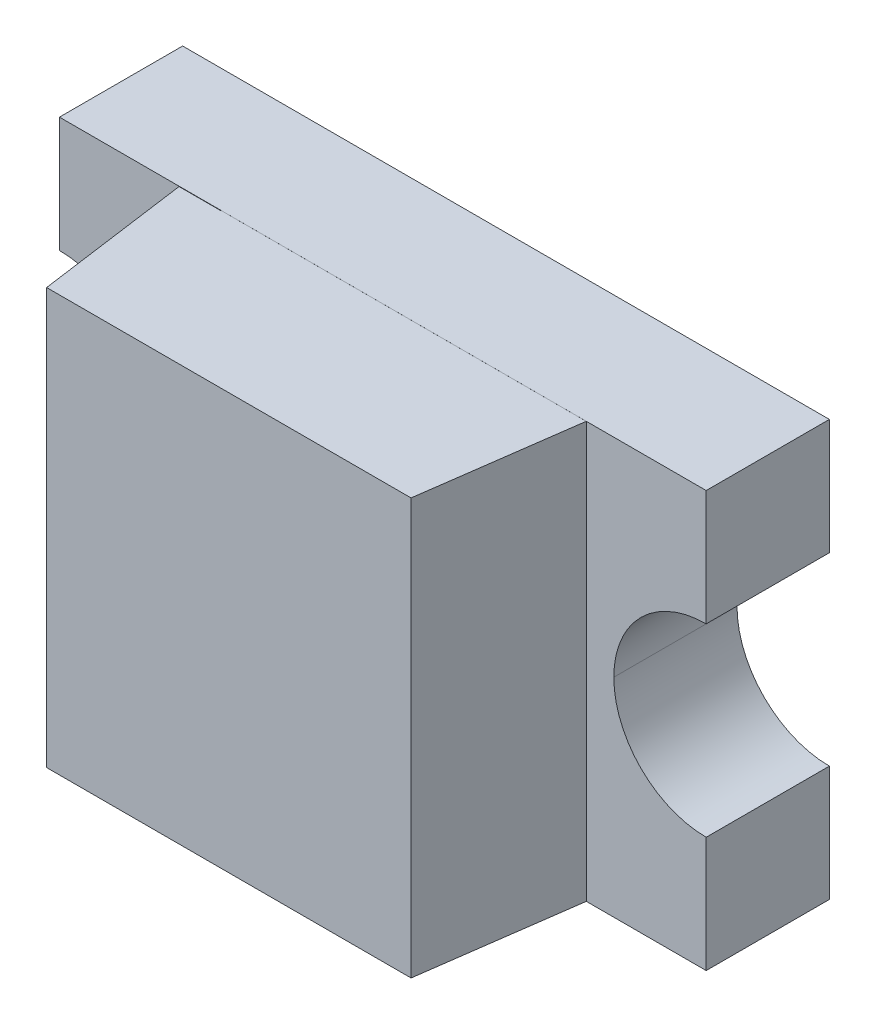
ISO-10303-21;
HEADER;
FILE_DESCRIPTION(('STEP AP214'),'2;1');
FILE_NAME('part.step','',(''),(''),'','','');
FILE_SCHEMA(('AUTOMOTIVE_DESIGN { 1 0 10303 214 1 1 1 1 }'));
ENDSEC;
DATA;
#1=APPLICATION_CONTEXT('core data for automotive mechanical design processes');
#2=APPLICATION_PROTOCOL_DEFINITION('international standard','automotive_design',2000,#1);
#3=PRODUCT_CONTEXT('',#1,'mechanical');
#4=PRODUCT('Part','Part','',(#3));
#5=PRODUCT_RELATED_PRODUCT_CATEGORY('part','',(#4));
#6=PRODUCT_DEFINITION_FORMATION('','',#4);
#7=PRODUCT_DEFINITION_CONTEXT('part definition',#1,'design');
#8=PRODUCT_DEFINITION('design','',#6,#7);
#9=PRODUCT_DEFINITION_SHAPE('','',#8);
#10=(LENGTH_UNIT() NAMED_UNIT(*) SI_UNIT(.MILLI.,.METRE.));
#11=(NAMED_UNIT(*) PLANE_ANGLE_UNIT() SI_UNIT($,.RADIAN.));
#12=(NAMED_UNIT(*) SI_UNIT($,.STERADIAN.) SOLID_ANGLE_UNIT());
#13=UNCERTAINTY_MEASURE_WITH_UNIT(LENGTH_MEASURE(1.E-05),#10,'distance_accuracy_value','');
#14=(GEOMETRIC_REPRESENTATION_CONTEXT(3) GLOBAL_UNCERTAINTY_ASSIGNED_CONTEXT((#13)) GLOBAL_UNIT_ASSIGNED_CONTEXT((#10,
#11,#12)) REPRESENTATION_CONTEXT('',''));
#15=CARTESIAN_POINT('',(0.,0.,0.));
#16=DIRECTION('',(0.,0.,1.));
#17=DIRECTION('',(1.,0.,0.));
#18=AXIS2_PLACEMENT_3D('',#15,#16,#17);
#19=CARTESIAN_POINT('',(0.,-0.675,0.));
#20=DIRECTION('',(0.,-1.,0.));
#21=DIRECTION('',(-1.,0.,0.));
#22=AXIS2_PLACEMENT_3D('',#19,#20,#21);
#23=PLANE('',#22);
#24=DIRECTION('',(-0.136719942335739,0.,-0.990609740194246));
#25=VECTOR('',#24,1.);
#26=CARTESIAN_POINT('',(-0.59167338261961,-0.675,0.9));
#27=LINE('',#26,#25);
#28=CARTESIAN_POINT('',(-0.59167338261961,-0.675,0.9));
#29=VERTEX_POINT('',#28);
#30=CARTESIAN_POINT('',(-0.660529539049008,-0.675,0.4011));
#31=VERTEX_POINT('',#30);
#32=EDGE_CURVE('P0_E11',#29,#31,#27,.T.);
#33=ORIENTED_EDGE('',*,*,#32,.T.);
#34=DIRECTION('',(-1.,0.,0.));
#35=VECTOR('',#34,1.);
#36=CARTESIAN_POINT('',(-0.524639744919153,-0.675,0.4011));
#37=LINE('',#36,#35);
#38=CARTESIAN_POINT('',(-0.524639744919153,-0.675,0.4011));
#39=VERTEX_POINT('',#38);
#40=EDGE_CURVE('P0_E134',#39,#31,#37,.T.);
#41=ORIENTED_EDGE('',*,*,#40,.F.);
#42=DIRECTION('',(0.,0.,1.));
#43=VECTOR('',#42,1.);
#44=CARTESIAN_POINT('',(-0.524639744919153,-0.675,0.4001));
#45=LINE('',#44,#43);
#46=CARTESIAN_POINT('',(-0.524639744919153,-0.675,0.4001));
#47=VERTEX_POINT('',#46);
#48=EDGE_CURVE('P0_E63',#47,#39,#45,.T.);
#49=ORIENTED_EDGE('',*,*,#48,.F.);
#50=DIRECTION('',(-1.,0.,0.));
#51=VECTOR('',#50,1.);
#52=CARTESIAN_POINT('',(0.660681356591747,-0.675,0.4001));
#53=LINE('',#52,#51);
#54=CARTESIAN_POINT('',(0.660681356591747,-0.675,0.4001));
#55=VERTEX_POINT('',#54);
#56=EDGE_CURVE('P0_E101',#55,#47,#53,.T.);
#57=ORIENTED_EDGE('',*,*,#56,.F.);
#58=DIRECTION('',(-0.136746780418113,0.,0.990606035740385));
#59=VECTOR('',#58,1.);
#60=CARTESIAN_POINT('',(0.660681356591747,-0.675,0.4001));
#61=LINE('',#60,#59);
#62=CARTESIAN_POINT('',(0.591673382619609,-0.675,0.9));
#63=VERTEX_POINT('',#62);
#64=EDGE_CURVE('P0_E107',#55,#63,#61,.T.);
#65=ORIENTED_EDGE('',*,*,#64,.T.);
#66=DIRECTION('',(1.,0.,0.));
#67=VECTOR('',#66,1.);
#68=CARTESIAN_POINT('',(-0.59167338261961,-0.675,0.9));
#69=LINE('',#68,#67);
#70=EDGE_CURVE('P0_E124',#29,#63,#69,.T.);
#71=ORIENTED_EDGE('',*,*,#70,.F.);
#72=EDGE_LOOP('',(#33,#41,#49,#57,#65,#71));
#73=FACE_BOUND('',#72,.T.);
#74=ADVANCED_FACE('P0_F16',(#73),#23,.T.);
#75=CARTESIAN_POINT('',(0.,0.675,0.));
#76=DIRECTION('',(0.,-1.,0.));
#77=DIRECTION('',(-1.,0.,0.));
#78=AXIS2_PLACEMENT_3D('',#75,#76,#77);
#79=PLANE('',#78);
#80=DIRECTION('',(1.,0.,0.));
#81=VECTOR('',#80,1.);
#82=CARTESIAN_POINT('',(-0.52463974491915,0.675,0.4011));
#83=LINE('',#82,#81);
#84=CARTESIAN_POINT('',(-0.660529539049006,0.675,0.4011));
#85=VERTEX_POINT('',#84);
#86=CARTESIAN_POINT('',(-0.52463974491915,0.675,0.4011));
#87=VERTEX_POINT('',#86);
#88=EDGE_CURVE('P0_E141',#85,#87,#83,.T.);
#89=ORIENTED_EDGE('',*,*,#88,.F.);
#90=DIRECTION('',(-0.136719942335739,0.,-0.990609740194246));
#91=VECTOR('',#90,1.);
#92=CARTESIAN_POINT('',(-0.591673382619608,0.675,0.9));
#93=LINE('',#92,#91);
#94=CARTESIAN_POINT('',(-0.591673382619608,0.675,0.9));
#95=VERTEX_POINT('',#94);
#96=EDGE_CURVE('P0_E25',#95,#85,#93,.T.);
#97=ORIENTED_EDGE('',*,*,#96,.F.);
#98=DIRECTION('',(-1.,0.,0.));
#99=VECTOR('',#98,1.);
#100=CARTESIAN_POINT('',(-0.591673382619608,0.675,0.9));
#101=LINE('',#100,#99);
#102=CARTESIAN_POINT('',(0.591673382619611,0.675,0.9));
#103=VERTEX_POINT('',#102);
#104=EDGE_CURVE('P0_E95',#103,#95,#101,.T.);
#105=ORIENTED_EDGE('',*,*,#104,.F.);
#106=DIRECTION('',(-0.136746780418113,0.,0.990606035740385));
#107=VECTOR('',#106,1.);
#108=CARTESIAN_POINT('',(0.660681356591749,0.675,0.4001));
#109=LINE('',#108,#107);
#110=CARTESIAN_POINT('',(0.660681356591749,0.675,0.4001));
#111=VERTEX_POINT('',#110);
#112=EDGE_CURVE('P0_E88',#111,#103,#109,.T.);
#113=ORIENTED_EDGE('',*,*,#112,.F.);
#114=DIRECTION('',(1.,0.,0.));
#115=VECTOR('',#114,1.);
#116=CARTESIAN_POINT('',(0.660681356591749,0.675,0.4001));
#117=LINE('',#116,#115);
#118=CARTESIAN_POINT('',(-0.52463974491915,0.675,0.4001));
#119=VERTEX_POINT('',#118);
#120=EDGE_CURVE('P0_E92',#119,#111,#117,.T.);
#121=ORIENTED_EDGE('',*,*,#120,.F.);
#122=DIRECTION('',(0.,0.,-1.));
#123=VECTOR('',#122,1.);
#124=CARTESIAN_POINT('',(-0.52463974491915,0.675,0.4001));
#125=LINE('',#124,#123);
#126=EDGE_CURVE('P0_E78',#87,#119,#125,.T.);
#127=ORIENTED_EDGE('',*,*,#126,.F.);
#128=EDGE_LOOP('',(#89,#97,#105,#113,#121,#127));
#129=FACE_BOUND('',#128,.T.);
#130=ADVANCED_FACE('P0_F90',(#129),#79,.F.);
#131=CARTESIAN_POINT('',(-0.626101460834309,-0.675,0.65055));
#132=DIRECTION('',(-0.990609740194246,0.,0.136719942335739));
#133=DIRECTION('',(0.,1.,0.));
#134=AXIS2_PLACEMENT_3D('',#131,#132,#133);
#135=PLANE('',#134);
#136=ORIENTED_EDGE('',*,*,#96,.T.);
#137=DIRECTION('',(0.,1.,0.));
#138=VECTOR('',#137,1.);
#139=CARTESIAN_POINT('',(-0.660529539049008,-0.675,0.4011));
#140=LINE('',#139,#138);
#141=EDGE_CURVE('P0_E130',#31,#85,#140,.T.);
#142=ORIENTED_EDGE('',*,*,#141,.F.);
#143=ORIENTED_EDGE('',*,*,#32,.F.);
#144=DIRECTION('',(0.,1.,0.));
#145=VECTOR('',#144,1.);
#146=CARTESIAN_POINT('',(-0.59167338261961,-0.675,0.9));
#147=LINE('',#146,#145);
#148=EDGE_CURVE('P0_E125',#29,#95,#147,.T.);
#149=ORIENTED_EDGE('',*,*,#148,.T.);
#150=EDGE_LOOP('',(#136,#142,#143,#149));
#151=FACE_BOUND('',#150,.T.);
#152=ADVANCED_FACE('P0_F170',(#151),#135,.T.);
#153=CARTESIAN_POINT('',(0.,-0.675,0.9));
#154=DIRECTION('',(0.,0.,1.));
#155=DIRECTION('',(0.,-1.,0.));
#156=AXIS2_PLACEMENT_3D('',#153,#154,#155);
#157=PLANE('',#156);
#158=ORIENTED_EDGE('',*,*,#104,.T.);
#159=ORIENTED_EDGE('',*,*,#148,.F.);
#160=ORIENTED_EDGE('',*,*,#70,.T.);
#161=DIRECTION('',(0.,1.,0.));
#162=VECTOR('',#161,1.);
#163=CARTESIAN_POINT('',(0.591673382619609,-0.675,0.9));
#164=LINE('',#163,#162);
#165=EDGE_CURVE('P0_E100',#63,#103,#164,.T.);
#166=ORIENTED_EDGE('',*,*,#165,.T.);
#167=EDGE_LOOP('',(#158,#159,#160,#166));
#168=FACE_BOUND('',#167,.T.);
#169=ADVANCED_FACE('P0_F151',(#168),#157,.T.);
#170=CARTESIAN_POINT('',(0.626177369605678,-0.675,0.65005));
#171=DIRECTION('',(0.990606035740385,0.,0.136746780418113));
#172=DIRECTION('',(0.,-1.,0.));
#173=AXIS2_PLACEMENT_3D('',#170,#171,#172);
#174=PLANE('',#173);
#175=ORIENTED_EDGE('',*,*,#112,.T.);
#176=ORIENTED_EDGE('',*,*,#165,.F.);
#177=ORIENTED_EDGE('',*,*,#64,.F.);
#178=DIRECTION('',(0.,1.,0.));
#179=VECTOR('',#178,1.);
#180=CARTESIAN_POINT('',(0.660681356591747,-0.675,0.4001));
#181=LINE('',#180,#179);
#182=EDGE_CURVE('P0_E104',#55,#111,#181,.T.);
#183=ORIENTED_EDGE('',*,*,#182,.T.);
#184=EDGE_LOOP('',(#175,#176,#177,#183));
#185=FACE_BOUND('',#184,.T.);
#186=ADVANCED_FACE('P0_F105',(#185),#174,.T.);
#187=CARTESIAN_POINT('',(0.0680208058362969,-0.675,0.4001));
#188=DIRECTION('',(0.,0.,-1.));
#189=DIRECTION('',(-1.,0.,0.));
#190=AXIS2_PLACEMENT_3D('',#187,#188,#189);
#191=PLANE('',#190);
#192=ORIENTED_EDGE('',*,*,#120,.T.);
#193=ORIENTED_EDGE('',*,*,#182,.F.);
#194=ORIENTED_EDGE('',*,*,#56,.T.);
#195=DIRECTION('',(0.,1.,0.));
#196=VECTOR('',#195,1.);
#197=CARTESIAN_POINT('',(-0.524639744919153,-0.675,0.4001));
#198=LINE('',#197,#196);
#199=EDGE_CURVE('P0_E113',#47,#119,#198,.T.);
#200=ORIENTED_EDGE('',*,*,#199,.T.);
#201=EDGE_LOOP('',(#192,#193,#194,#200));
#202=FACE_BOUND('',#201,.T.);
#203=ADVANCED_FACE('P0_F112',(#202),#191,.T.);
#204=CARTESIAN_POINT('',(-0.524639744919153,-0.675,0.4006));
#205=DIRECTION('',(-1.,0.,0.));
#206=DIRECTION('',(0.,0.,1.));
#207=AXIS2_PLACEMENT_3D('',#204,#205,#206);
#208=PLANE('',#207);
#209=ORIENTED_EDGE('',*,*,#126,.T.);
#210=ORIENTED_EDGE('',*,*,#199,.F.);
#211=ORIENTED_EDGE('',*,*,#48,.T.);
#212=DIRECTION('',(0.,1.,0.));
#213=VECTOR('',#212,1.);
#214=CARTESIAN_POINT('',(-0.524639744919153,-0.675,0.4011));
#215=LINE('',#214,#213);
#216=EDGE_CURVE('P0_E144',#39,#87,#215,.T.);
#217=ORIENTED_EDGE('',*,*,#216,.T.);
#218=EDGE_LOOP('',(#209,#210,#211,#217));
#219=FACE_BOUND('',#218,.T.);
#220=ADVANCED_FACE('P0_F223',(#219),#208,.T.);
#221=CARTESIAN_POINT('',(-0.59258464198408,-0.675,0.4011));
#222=DIRECTION('',(0.,0.,-1.));
#223=DIRECTION('',(0.,-1.,0.));
#224=AXIS2_PLACEMENT_3D('',#221,#222,#223);
#225=PLANE('',#224);
#226=ORIENTED_EDGE('',*,*,#88,.T.);
#227=ORIENTED_EDGE('',*,*,#216,.F.);
#228=ORIENTED_EDGE('',*,*,#40,.T.);
#229=ORIENTED_EDGE('',*,*,#141,.T.);
#230=EDGE_LOOP('',(#226,#227,#228,#229));
#231=FACE_BOUND('',#230,.T.);
#232=ADVANCED_FACE('P0_F169',(#231),#225,.T.);
#233=CLOSED_SHELL('',(#74,#130,#152,#169,#186,#203,#220,#232));
#234=MANIFOLD_SOLID_BREP('P0_B1',#233);
#235=CARTESIAN_POINT('',(0.,0.675,0.));
#236=DIRECTION('',(0.,1.,0.));
#237=DIRECTION('',(1.,0.,0.));
#238=AXIS2_PLACEMENT_3D('',#235,#236,#237);
#239=PLANE('',#238);
#240=DIRECTION('',(1.,0.,0.));
#241=VECTOR('',#240,1.);
#242=CARTESIAN_POINT('',(1.05,0.675,0.4));
#243=LINE('',#242,#241);
#244=CARTESIAN_POINT('',(-1.05,0.675,0.4));
#245=VERTEX_POINT('',#244);
#246=CARTESIAN_POINT('',(1.05,0.675,0.4));
#247=VERTEX_POINT('',#246);
#248=EDGE_CURVE('P1_E176',#245,#247,#243,.T.);
#249=ORIENTED_EDGE('',*,*,#248,.T.);
#250=DIRECTION('',(0.,0.,1.));
#251=VECTOR('',#250,1.);
#252=CARTESIAN_POINT('',(1.05,0.675,0.));
#253=LINE('',#252,#251);
#254=CARTESIAN_POINT('',(1.05,0.675,0.));
#255=VERTEX_POINT('',#254);
#256=EDGE_CURVE('P1_E162',#255,#247,#253,.T.);
#257=ORIENTED_EDGE('',*,*,#256,.F.);
#258=DIRECTION('',(-1.,0.,0.));
#259=VECTOR('',#258,1.);
#260=CARTESIAN_POINT('',(1.05,0.675,0.));
#261=LINE('',#260,#259);
#262=CARTESIAN_POINT('',(-1.05,0.675,0.));
#263=VERTEX_POINT('',#262);
#264=EDGE_CURVE('P1_E20',#255,#263,#261,.T.);
#265=ORIENTED_EDGE('',*,*,#264,.T.);
#266=DIRECTION('',(0.,0.,1.));
#267=VECTOR('',#266,1.);
#268=CARTESIAN_POINT('',(-1.05,0.675,0.));
#269=LINE('',#268,#267);
#270=EDGE_CURVE('P1_E27',#263,#245,#269,.T.);
#271=ORIENTED_EDGE('',*,*,#270,.T.);
#272=EDGE_LOOP('',(#249,#257,#265,#271));
#273=FACE_BOUND('',#272,.T.);
#274=ADVANCED_FACE('P1_F16',(#273),#239,.T.);
#275=CARTESIAN_POINT('',(0.,-0.675,0.));
#276=DIRECTION('',(0.,-1.,0.));
#277=DIRECTION('',(-1.,0.,0.));
#278=AXIS2_PLACEMENT_3D('',#275,#276,#277);
#279=PLANE('',#278);
#280=DIRECTION('',(-1.,0.,0.));
#281=VECTOR('',#280,1.);
#282=CARTESIAN_POINT('',(-1.05,-0.675,0.4));
#283=LINE('',#282,#281);
#284=CARTESIAN_POINT('',(1.05,-0.675,0.4));
#285=VERTEX_POINT('',#284);
#286=CARTESIAN_POINT('',(-1.05,-0.675,0.4));
#287=VERTEX_POINT('',#286);
#288=EDGE_CURVE('P1_E182',#285,#287,#283,.T.);
#289=ORIENTED_EDGE('',*,*,#288,.T.);
#290=DIRECTION('',(0.,0.,1.));
#291=VECTOR('',#290,1.);
#292=CARTESIAN_POINT('',(-1.05,-0.675,0.));
#293=LINE('',#292,#291);
#294=CARTESIAN_POINT('',(-1.05,-0.675,0.));
#295=VERTEX_POINT('',#294);
#296=EDGE_CURVE('P1_E11',#295,#287,#293,.T.);
#297=ORIENTED_EDGE('',*,*,#296,.F.);
#298=DIRECTION('',(1.,0.,0.));
#299=VECTOR('',#298,1.);
#300=CARTESIAN_POINT('',(-1.05,-0.675,0.));
#301=LINE('',#300,#299);
#302=CARTESIAN_POINT('',(1.05,-0.675,0.));
#303=VERTEX_POINT('',#302);
#304=EDGE_CURVE('P1_E186',#295,#303,#301,.T.);
#305=ORIENTED_EDGE('',*,*,#304,.T.);
#306=DIRECTION('',(0.,0.,1.));
#307=VECTOR('',#306,1.);
#308=CARTESIAN_POINT('',(1.05,-0.675,0.));
#309=LINE('',#308,#307);
#310=EDGE_CURVE('P1_E181',#303,#285,#309,.T.);
#311=ORIENTED_EDGE('',*,*,#310,.T.);
#312=EDGE_LOOP('',(#289,#297,#305,#311));
#313=FACE_BOUND('',#312,.T.);
#314=ADVANCED_FACE('P1_F255',(#313),#279,.T.);
#315=CARTESIAN_POINT('',(-1.05,-0.4875,0.));
#316=DIRECTION('',(-1.,0.,0.));
#317=DIRECTION('',(0.,1.,0.));
#318=AXIS2_PLACEMENT_3D('',#315,#316,#317);
#319=PLANE('',#318);
#320=DIRECTION('',(0.,0.,1.));
#321=VECTOR('',#320,1.);
#322=CARTESIAN_POINT('',(-1.05,-0.3,0.4));
#323=LINE('',#322,#321);
#324=CARTESIAN_POINT('',(-1.05,-0.3,0.));
#325=VERTEX_POINT('',#324);
#326=CARTESIAN_POINT('',(-1.05,-0.300000000000027,0.4));
#327=VERTEX_POINT('',#326);
#328=EDGE_CURVE('P1_E157',#325,#327,#323,.T.);
#329=ORIENTED_EDGE('',*,*,#328,.F.);
#330=DIRECTION('',(0.,-1.,0.));
#331=VECTOR('',#330,1.);
#332=CARTESIAN_POINT('',(-1.05,0.655,0.));
#333=LINE('',#332,#331);
#334=EDGE_CURVE('P1_E206',#325,#295,#333,.T.);
#335=ORIENTED_EDGE('',*,*,#334,.T.);
#336=ORIENTED_EDGE('',*,*,#296,.T.);
#337=DIRECTION('',(0.,1.,0.));
#338=VECTOR('',#337,1.);
#339=CARTESIAN_POINT('',(-1.05,-0.655,0.4));
#340=LINE('',#339,#338);
#341=EDGE_CURVE('P1_E187',#287,#327,#340,.T.);
#342=ORIENTED_EDGE('',*,*,#341,.T.);
#343=EDGE_LOOP('',(#329,#335,#336,#342));
#344=FACE_BOUND('',#343,.T.);
#345=ADVANCED_FACE('P1_F252',(#344),#319,.T.);
#346=CARTESIAN_POINT('',(-1.05,-0.4875,0.));
#347=DIRECTION('',(-1.,0.,0.));
#348=DIRECTION('',(0.,1.,0.));
#349=AXIS2_PLACEMENT_3D('',#346,#347,#348);
#350=PLANE('',#349);
#351=DIRECTION('',(0.,-1.,0.));
#352=VECTOR('',#351,1.);
#353=CARTESIAN_POINT('',(-1.05,0.655,0.));
#354=LINE('',#353,#352);
#355=CARTESIAN_POINT('',(-1.05,0.3,0.));
#356=VERTEX_POINT('',#355);
#357=EDGE_CURVE('P1_E172',#263,#356,#354,.T.);
#358=ORIENTED_EDGE('',*,*,#357,.T.);
#359=DIRECTION('',(0.,0.,-1.));
#360=VECTOR('',#359,1.);
#361=CARTESIAN_POINT('',(-1.05000000000002,0.3,0.4));
#362=LINE('',#361,#360);
#363=CARTESIAN_POINT('',(-1.05,0.3,0.4));
#364=VERTEX_POINT('',#363);
#365=EDGE_CURVE('P1_E199',#364,#356,#362,.T.);
#366=ORIENTED_EDGE('',*,*,#365,.F.);
#367=DIRECTION('',(0.,1.,0.));
#368=VECTOR('',#367,1.);
#369=CARTESIAN_POINT('',(-1.05,-0.655,0.4));
#370=LINE('',#369,#368);
#371=EDGE_CURVE('P1_E180',#364,#245,#370,.T.);
#372=ORIENTED_EDGE('',*,*,#371,.T.);
#373=ORIENTED_EDGE('',*,*,#270,.F.);
#374=EDGE_LOOP('',(#358,#366,#372,#373));
#375=FACE_BOUND('',#374,.T.);
#376=ADVANCED_FACE('P1_F241',(#375),#350,.T.);
#377=CARTESIAN_POINT('',(-1.05,0.,0.4));
#378=DIRECTION('',(0.,0.,1.));
#379=DIRECTION('',(1.,0.,0.));
#380=AXIS2_PLACEMENT_3D('',#377,#378,#379);
#381=CYLINDRICAL_SURFACE('',#380,0.3);
#382=DIRECTION('',(0.,0.,1.));
#383=VECTOR('',#382,1.);
#384=CARTESIAN_POINT('',(-0.75,0.,0.4));
#385=LINE('',#384,#383);
#386=CARTESIAN_POINT('',(-0.75,0.,0.));
#387=VERTEX_POINT('',#386);
#388=CARTESIAN_POINT('',(-0.75,0.,0.4));
#389=VERTEX_POINT('',#388);
#390=EDGE_CURVE('P1_E193',#387,#389,#385,.T.);
#391=ORIENTED_EDGE('',*,*,#390,.T.);
#392=CARTESIAN_POINT('',(-1.05,0.,0.4));
#393=DIRECTION('',(0.,0.,1.));
#394=DIRECTION('',(1.,0.,0.));
#395=AXIS2_PLACEMENT_3D('',#392,#393,#394);
#396=CIRCLE('',#395,0.3);
#397=EDGE_CURVE('P1_E196',#389,#364,#396,.T.);
#398=ORIENTED_EDGE('',*,*,#397,.T.);
#399=ORIENTED_EDGE('',*,*,#365,.T.);
#400=CARTESIAN_POINT('',(-1.05,0.,0.));
#401=DIRECTION('',(0.,0.,-1.));
#402=DIRECTION('',(1.,0.,0.));
#403=AXIS2_PLACEMENT_3D('',#400,#401,#402);
#404=CIRCLE('',#403,0.3);
#405=EDGE_CURVE('P1_E175',#356,#387,#404,.T.);
#406=ORIENTED_EDGE('',*,*,#405,.T.);
#407=EDGE_LOOP('',(#391,#398,#399,#406));
#408=FACE_BOUND('',#407,.T.);
#409=ADVANCED_FACE('P1_F244',(#408),#381,.F.);
#410=CARTESIAN_POINT('',(0.,0.,0.));
#411=DIRECTION('',(0.,0.,-1.));
#412=DIRECTION('',(0.,-1.,0.));
#413=AXIS2_PLACEMENT_3D('',#410,#411,#412);
#414=PLANE('',#413);
#415=CARTESIAN_POINT('',(1.05,0.,0.));
#416=DIRECTION('',(0.,0.,-1.));
#417=DIRECTION('',(1.,0.,0.));
#418=AXIS2_PLACEMENT_3D('',#415,#416,#417);
#419=CIRCLE('',#418,0.299999999999989);
#420=CARTESIAN_POINT('',(1.05,-0.299999999999989,0.));
#421=VERTEX_POINT('',#420);
#422=CARTESIAN_POINT('',(0.75,0.,0.));
#423=VERTEX_POINT('',#422);
#424=EDGE_CURVE('P1_E149',#421,#423,#419,.T.);
#425=ORIENTED_EDGE('',*,*,#424,.F.);
#426=DIRECTION('',(0.,1.,0.));
#427=VECTOR('',#426,1.);
#428=CARTESIAN_POINT('',(1.05,-0.655,0.));
#429=LINE('',#428,#427);
#430=EDGE_CURVE('P1_E171',#303,#421,#429,.T.);
#431=ORIENTED_EDGE('',*,*,#430,.F.);
#432=ORIENTED_EDGE('',*,*,#304,.F.);
#433=ORIENTED_EDGE('',*,*,#334,.F.);
#434=CARTESIAN_POINT('',(-1.05,0.,0.));
#435=DIRECTION('',(0.,0.,-1.));
#436=DIRECTION('',(1.,0.,0.));
#437=AXIS2_PLACEMENT_3D('',#434,#435,#436);
#438=CIRCLE('',#437,0.3);
#439=EDGE_CURVE('P1_E168',#387,#325,#438,.T.);
#440=ORIENTED_EDGE('',*,*,#439,.F.);
#441=ORIENTED_EDGE('',*,*,#405,.F.);
#442=ORIENTED_EDGE('',*,*,#357,.F.);
#443=ORIENTED_EDGE('',*,*,#264,.F.);
#444=DIRECTION('',(0.,1.,0.));
#445=VECTOR('',#444,1.);
#446=CARTESIAN_POINT('',(1.05,-0.655,0.));
#447=LINE('',#446,#445);
#448=CARTESIAN_POINT('',(1.05,0.299999999999988,0.));
#449=VERTEX_POINT('',#448);
#450=EDGE_CURVE('P1_E91',#449,#255,#447,.T.);
#451=ORIENTED_EDGE('',*,*,#450,.F.);
#452=CARTESIAN_POINT('',(1.05,0.,0.));
#453=DIRECTION('',(0.,0.,-1.));
#454=DIRECTION('',(1.,0.,0.));
#455=AXIS2_PLACEMENT_3D('',#452,#453,#454);
#456=CIRCLE('',#455,0.299999999999989);
#457=EDGE_CURVE('P1_E215',#423,#449,#456,.T.);
#458=ORIENTED_EDGE('',*,*,#457,.F.);
#459=EDGE_LOOP('',(#425,#431,#432,#433,#440,#441,#442,#443,#451,#458));
#460=FACE_BOUND('',#459,.T.);
#461=ADVANCED_FACE('P1_F260',(#460),#414,.T.);
#462=CARTESIAN_POINT('',(0.,0.,0.4));
#463=DIRECTION('',(0.,0.,-1.));
#464=DIRECTION('',(0.,-1.,0.));
#465=AXIS2_PLACEMENT_3D('',#462,#463,#464);
#466=PLANE('',#465);
#467=CARTESIAN_POINT('',(1.05,0.,0.4));
#468=DIRECTION('',(0.,0.,1.));
#469=DIRECTION('',(1.,0.,0.));
#470=AXIS2_PLACEMENT_3D('',#467,#468,#469);
#471=CIRCLE('',#470,0.299999999999989);
#472=CARTESIAN_POINT('',(1.05,0.3,0.4));
#473=VERTEX_POINT('',#472);
#474=CARTESIAN_POINT('',(0.75,0.,0.4));
#475=VERTEX_POINT('',#474);
#476=EDGE_CURVE('P1_E125',#473,#475,#471,.T.);
#477=ORIENTED_EDGE('',*,*,#476,.F.);
#478=DIRECTION('',(0.,-1.,0.));
#479=VECTOR('',#478,1.);
#480=CARTESIAN_POINT('',(1.05,0.655,0.4));
#481=LINE('',#480,#479);
#482=EDGE_CURVE('P1_E77',#247,#473,#481,.T.);
#483=ORIENTED_EDGE('',*,*,#482,.F.);
#484=ORIENTED_EDGE('',*,*,#248,.F.);
#485=ORIENTED_EDGE('',*,*,#371,.F.);
#486=ORIENTED_EDGE('',*,*,#397,.F.);
#487=CARTESIAN_POINT('',(-1.05,0.,0.4));
#488=DIRECTION('',(0.,0.,1.));
#489=DIRECTION('',(1.,0.,0.));
#490=AXIS2_PLACEMENT_3D('',#487,#488,#489);
#491=CIRCLE('',#490,0.3);
#492=EDGE_CURVE('P1_E151',#327,#389,#491,.T.);
#493=ORIENTED_EDGE('',*,*,#492,.F.);
#494=ORIENTED_EDGE('',*,*,#341,.F.);
#495=ORIENTED_EDGE('',*,*,#288,.F.);
#496=DIRECTION('',(0.,-1.,0.));
#497=VECTOR('',#496,1.);
#498=CARTESIAN_POINT('',(1.05,0.655,0.4));
#499=LINE('',#498,#497);
#500=CARTESIAN_POINT('',(1.05,-0.299999999999881,0.4));
#501=VERTEX_POINT('',#500);
#502=EDGE_CURVE('P1_E139',#501,#285,#499,.T.);
#503=ORIENTED_EDGE('',*,*,#502,.F.);
#504=CARTESIAN_POINT('',(1.05,0.,0.4));
#505=DIRECTION('',(0.,0.,1.));
#506=DIRECTION('',(1.,0.,0.));
#507=AXIS2_PLACEMENT_3D('',#504,#505,#506);
#508=CIRCLE('',#507,0.299999999999989);
#509=EDGE_CURVE('P1_E136',#475,#501,#508,.T.);
#510=ORIENTED_EDGE('',*,*,#509,.F.);
#511=EDGE_LOOP('',(#477,#483,#484,#485,#486,#493,#494,#495,#503,#510));
#512=FACE_BOUND('',#511,.T.);
#513=ADVANCED_FACE('P1_F137',(#512),#466,.F.);
#514=CARTESIAN_POINT('',(1.05,0.4875,0.));
#515=DIRECTION('',(1.,0.,0.));
#516=DIRECTION('',(0.,-1.,0.));
#517=AXIS2_PLACEMENT_3D('',#514,#515,#516);
#518=PLANE('',#517);
#519=ORIENTED_EDGE('',*,*,#430,.T.);
#520=DIRECTION('',(0.,0.,-1.));
#521=VECTOR('',#520,1.);
#522=CARTESIAN_POINT('',(1.04999999999997,-0.299999999999989,0.4));
#523=LINE('',#522,#521);
#524=EDGE_CURVE('P1_E144',#501,#421,#523,.T.);
#525=ORIENTED_EDGE('',*,*,#524,.F.);
#526=ORIENTED_EDGE('',*,*,#502,.T.);
#527=ORIENTED_EDGE('',*,*,#310,.F.);
#528=EDGE_LOOP('',(#519,#525,#526,#527));
#529=FACE_BOUND('',#528,.T.);
#530=ADVANCED_FACE('P1_F259',(#529),#518,.T.);
#531=CARTESIAN_POINT('',(1.05,0.4875,0.));
#532=DIRECTION('',(1.,0.,0.));
#533=DIRECTION('',(0.,-1.,0.));
#534=AXIS2_PLACEMENT_3D('',#531,#532,#533);
#535=PLANE('',#534);
#536=DIRECTION('',(0.,0.,1.));
#537=VECTOR('',#536,1.);
#538=CARTESIAN_POINT('',(1.05,0.299999999999988,0.4));
#539=LINE('',#538,#537);
#540=EDGE_CURVE('P1_E131',#449,#473,#539,.T.);
#541=ORIENTED_EDGE('',*,*,#540,.F.);
#542=ORIENTED_EDGE('',*,*,#450,.T.);
#543=ORIENTED_EDGE('',*,*,#256,.T.);
#544=ORIENTED_EDGE('',*,*,#482,.T.);
#545=EDGE_LOOP('',(#541,#542,#543,#544));
#546=FACE_BOUND('',#545,.T.);
#547=ADVANCED_FACE('P1_F234',(#546),#535,.T.);
#548=CARTESIAN_POINT('',(1.05,0.,0.4));
#549=DIRECTION('',(0.,0.,1.));
#550=DIRECTION('',(1.,0.,0.));
#551=AXIS2_PLACEMENT_3D('',#548,#549,#550);
#552=CYLINDRICAL_SURFACE('',#551,0.299999999999989);
#553=DIRECTION('',(0.,0.,-1.));
#554=VECTOR('',#553,1.);
#555=CARTESIAN_POINT('',(0.75,0.,0.4));
#556=LINE('',#555,#554);
#557=EDGE_CURVE('P1_E130',#475,#423,#556,.T.);
#558=ORIENTED_EDGE('',*,*,#557,.T.);
#559=ORIENTED_EDGE('',*,*,#457,.T.);
#560=ORIENTED_EDGE('',*,*,#540,.T.);
#561=ORIENTED_EDGE('',*,*,#476,.T.);
#562=EDGE_LOOP('',(#558,#559,#560,#561));
#563=FACE_BOUND('',#562,.T.);
#564=ADVANCED_FACE('P1_F127',(#563),#552,.F.);
#565=CARTESIAN_POINT('',(1.05,0.,0.4));
#566=DIRECTION('',(0.,0.,1.));
#567=DIRECTION('',(1.,0.,0.));
#568=AXIS2_PLACEMENT_3D('',#565,#566,#567);
#569=CYLINDRICAL_SURFACE('',#568,0.299999999999989);
#570=ORIENTED_EDGE('',*,*,#557,.F.);
#571=ORIENTED_EDGE('',*,*,#509,.T.);
#572=ORIENTED_EDGE('',*,*,#524,.T.);
#573=ORIENTED_EDGE('',*,*,#424,.T.);
#574=EDGE_LOOP('',(#570,#571,#572,#573));
#575=FACE_BOUND('',#574,.T.);
#576=ADVANCED_FACE('P1_F147',(#575),#569,.F.);
#577=CARTESIAN_POINT('',(-1.05,0.,0.4));
#578=DIRECTION('',(0.,0.,1.));
#579=DIRECTION('',(1.,0.,0.));
#580=AXIS2_PLACEMENT_3D('',#577,#578,#579);
#581=CYLINDRICAL_SURFACE('',#580,0.3);
#582=ORIENTED_EDGE('',*,*,#390,.F.);
#583=ORIENTED_EDGE('',*,*,#439,.T.);
#584=ORIENTED_EDGE('',*,*,#328,.T.);
#585=ORIENTED_EDGE('',*,*,#492,.T.);
#586=EDGE_LOOP('',(#582,#583,#584,#585));
#587=FACE_BOUND('',#586,.T.);
#588=ADVANCED_FACE('P1_F18',(#587),#581,.F.);
#589=CLOSED_SHELL('',(#274,#314,#345,#376,#409,#461,#513,#530,#547,#564,#576,#588));
#590=MANIFOLD_SOLID_BREP('P1_B1',#589);
#591=ADVANCED_BREP_SHAPE_REPRESENTATION('',(#18,#234,#590),#14);
#592=SHAPE_DEFINITION_REPRESENTATION(#9,#591);
ENDSEC;
END-ISO-10303-21;
